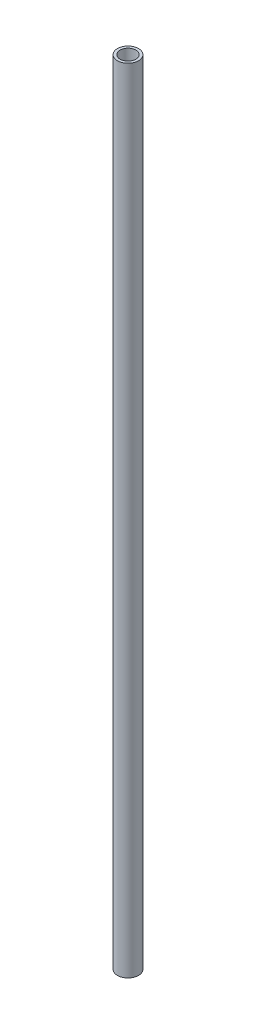
ISO-10303-21;
HEADER;
FILE_DESCRIPTION(('STEP AP214'),'2;1');
FILE_NAME('part.step','',(''),(''),'','','');
FILE_SCHEMA(('AUTOMOTIVE_DESIGN { 1 0 10303 214 1 1 1 1 }'));
ENDSEC;
DATA;
#1=APPLICATION_CONTEXT('core data for automotive mechanical design processes');
#2=APPLICATION_PROTOCOL_DEFINITION('international standard','automotive_design',2000,#1);
#3=PRODUCT_CONTEXT('',#1,'mechanical');
#4=PRODUCT('Part','Part','',(#3));
#5=PRODUCT_RELATED_PRODUCT_CATEGORY('part','',(#4));
#6=PRODUCT_DEFINITION_FORMATION('','',#4);
#7=PRODUCT_DEFINITION_CONTEXT('part definition',#1,'design');
#8=PRODUCT_DEFINITION('design','',#6,#7);
#9=PRODUCT_DEFINITION_SHAPE('','',#8);
#10=(LENGTH_UNIT() NAMED_UNIT(*) SI_UNIT(.MILLI.,.METRE.));
#11=(NAMED_UNIT(*) PLANE_ANGLE_UNIT() SI_UNIT($,.RADIAN.));
#12=(NAMED_UNIT(*) SI_UNIT($,.STERADIAN.) SOLID_ANGLE_UNIT());
#13=UNCERTAINTY_MEASURE_WITH_UNIT(LENGTH_MEASURE(1.E-05),#10,'distance_accuracy_value','');
#14=(GEOMETRIC_REPRESENTATION_CONTEXT(3) GLOBAL_UNCERTAINTY_ASSIGNED_CONTEXT((#13)) GLOBAL_UNIT_ASSIGNED_CONTEXT((#10,
#11,#12)) REPRESENTATION_CONTEXT('',''));
#15=CARTESIAN_POINT('',(0.,0.,0.));
#16=DIRECTION('',(0.,0.,1.));
#17=DIRECTION('',(1.,0.,0.));
#18=AXIS2_PLACEMENT_3D('',#15,#16,#17);
#19=CARTESIAN_POINT('',(0.,-87.5,0.));
#20=DIRECTION('',(0.,1.,0.));
#21=DIRECTION('',(0.,0.,1.));
#22=AXIS2_PLACEMENT_3D('',#19,#20,#21);
#23=PLANE('',#22);
#24=CARTESIAN_POINT('',(0.,-87.5,0.));
#25=DIRECTION('',(0.,1.,0.));
#26=DIRECTION('',(0.,0.,1.));
#27=AXIS2_PLACEMENT_3D('',#24,#25,#26);
#28=CIRCLE('',#27,4.);
#29=CARTESIAN_POINT('',(0.,-87.5,4.));
#30=VERTEX_POINT('',#29);
#31=EDGE_CURVE('E10',#30,#30,#28,.T.);
#32=ORIENTED_EDGE('',*,*,#31,.F.);
#33=EDGE_LOOP('',(#32));
#34=FACE_BOUND('',#33,.T.);
#35=CARTESIAN_POINT('',(0.,-87.5,0.));
#36=DIRECTION('',(0.,1.,0.));
#37=DIRECTION('',(0.,0.,1.));
#38=AXIS2_PLACEMENT_3D('',#35,#36,#37);
#39=CIRCLE('',#38,3.);
#40=CARTESIAN_POINT('',(0.,-87.5,3.));
#41=VERTEX_POINT('',#40);
#42=EDGE_CURVE('E53',#41,#41,#39,.T.);
#43=ORIENTED_EDGE('',*,*,#42,.T.);
#44=EDGE_LOOP('',(#43));
#45=FACE_BOUND('',#44,.T.);
#46=ADVANCED_FACE('F45',(#34,#45),#23,.F.);
#47=CARTESIAN_POINT('',(0.,87.5,0.));
#48=DIRECTION('',(0.,-1.,0.));
#49=DIRECTION('',(0.,0.,-1.));
#50=AXIS2_PLACEMENT_3D('',#47,#48,#49);
#51=CYLINDRICAL_SURFACE('',#50,4.);
#52=ORIENTED_EDGE('',*,*,#31,.T.);
#53=EDGE_LOOP('',(#52));
#54=FACE_BOUND('',#53,.T.);
#55=CARTESIAN_POINT('',(0.,212.5,0.));
#56=DIRECTION('',(0.,1.,0.));
#57=DIRECTION('',(0.,0.,1.));
#58=AXIS2_PLACEMENT_3D('',#55,#56,#57);
#59=CIRCLE('',#58,4.);
#60=CARTESIAN_POINT('',(0.,212.5,4.));
#61=VERTEX_POINT('',#60);
#62=EDGE_CURVE('E58',#61,#61,#59,.T.);
#63=ORIENTED_EDGE('',*,*,#62,.F.);
#64=EDGE_LOOP('',(#63));
#65=FACE_BOUND('',#64,.T.);
#66=ADVANCED_FACE('F47',(#54,#65),#51,.T.);
#67=CARTESIAN_POINT('',(0.,87.5,0.));
#68=DIRECTION('',(0.,-1.,0.));
#69=DIRECTION('',(0.,0.,-1.));
#70=AXIS2_PLACEMENT_3D('',#67,#68,#69);
#71=CYLINDRICAL_SURFACE('',#70,3.);
#72=ORIENTED_EDGE('',*,*,#42,.F.);
#73=EDGE_LOOP('',(#72));
#74=FACE_BOUND('',#73,.T.);
#75=CARTESIAN_POINT('',(0.,212.5,0.));
#76=DIRECTION('',(0.,1.,0.));
#77=DIRECTION('',(0.,0.,1.));
#78=AXIS2_PLACEMENT_3D('',#75,#76,#77);
#79=CIRCLE('',#78,3.);
#80=CARTESIAN_POINT('',(0.,212.5,3.));
#81=VERTEX_POINT('',#80);
#82=EDGE_CURVE('E63',#81,#81,#79,.T.);
#83=ORIENTED_EDGE('',*,*,#82,.T.);
#84=EDGE_LOOP('',(#83));
#85=FACE_BOUND('',#84,.T.);
#86=ADVANCED_FACE('F70',(#74,#85),#71,.F.);
#87=CARTESIAN_POINT('',(0.,212.5,0.));
#88=DIRECTION('',(0.,1.,0.));
#89=DIRECTION('',(0.,0.,1.));
#90=AXIS2_PLACEMENT_3D('',#87,#88,#89);
#91=PLANE('',#90);
#92=ORIENTED_EDGE('',*,*,#62,.T.);
#93=EDGE_LOOP('',(#92));
#94=FACE_BOUND('',#93,.T.);
#95=ORIENTED_EDGE('',*,*,#82,.F.);
#96=EDGE_LOOP('',(#95));
#97=FACE_BOUND('',#96,.T.);
#98=ADVANCED_FACE('F72',(#94,#97),#91,.T.);
#99=CLOSED_SHELL('',(#46,#66,#86,#98));
#100=MANIFOLD_SOLID_BREP('B2',#99);
#101=ADVANCED_BREP_SHAPE_REPRESENTATION('',(#18,#100),#14);
#102=SHAPE_DEFINITION_REPRESENTATION(#9,#101);
ENDSEC;
END-ISO-10303-21;
